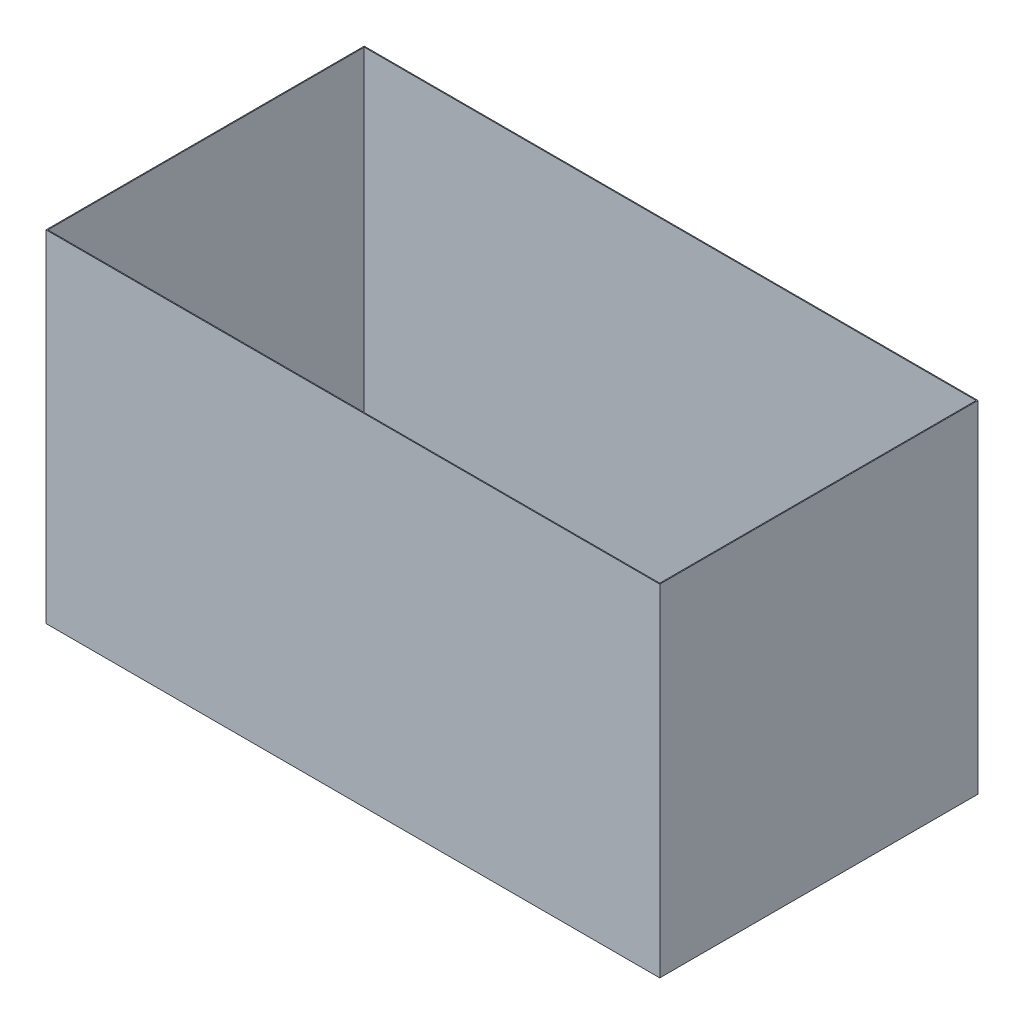
ISO-10303-21;
HEADER;
FILE_DESCRIPTION(('STEP AP214'),'2;1');
FILE_NAME('part.step','',(''),(''),'','','');
FILE_SCHEMA(('AUTOMOTIVE_DESIGN { 1 0 10303 214 1 1 1 1 }'));
ENDSEC;
DATA;
#1=APPLICATION_CONTEXT('core data for automotive mechanical design processes');
#2=APPLICATION_PROTOCOL_DEFINITION('international standard','automotive_design',2000,#1);
#3=PRODUCT_CONTEXT('',#1,'mechanical');
#4=PRODUCT('Part','Part','',(#3));
#5=PRODUCT_RELATED_PRODUCT_CATEGORY('part','',(#4));
#6=PRODUCT_DEFINITION_FORMATION('','',#4);
#7=PRODUCT_DEFINITION_CONTEXT('part definition',#1,'design');
#8=PRODUCT_DEFINITION('design','',#6,#7);
#9=PRODUCT_DEFINITION_SHAPE('','',#8);
#10=(LENGTH_UNIT() NAMED_UNIT(*) SI_UNIT(.MILLI.,.METRE.));
#11=(NAMED_UNIT(*) PLANE_ANGLE_UNIT() SI_UNIT($,.RADIAN.));
#12=(NAMED_UNIT(*) SI_UNIT($,.STERADIAN.) SOLID_ANGLE_UNIT());
#13=UNCERTAINTY_MEASURE_WITH_UNIT(LENGTH_MEASURE(1.E-05),#10,'distance_accuracy_value','');
#14=(GEOMETRIC_REPRESENTATION_CONTEXT(3) GLOBAL_UNCERTAINTY_ASSIGNED_CONTEXT((#13)) GLOBAL_UNIT_ASSIGNED_CONTEXT((#10,
#11,#12)) REPRESENTATION_CONTEXT('',''));
#15=CARTESIAN_POINT('',(0.,0.,0.));
#16=DIRECTION('',(0.,0.,1.));
#17=DIRECTION('',(1.,0.,0.));
#18=AXIS2_PLACEMENT_3D('',#15,#16,#17);
#19=CARTESIAN_POINT('',(0.,750.,0.));
#20=DIRECTION('',(0.,-1.,0.));
#21=DIRECTION('',(0.,0.,-1.));
#22=AXIS2_PLACEMENT_3D('',#19,#20,#21);
#23=PLANE('',#22);
#24=DIRECTION('',(0.,0.,1.));
#25=VECTOR('',#24,1.);
#26=CARTESIAN_POINT('',(0.,750.,0.));
#27=LINE('',#26,#25);
#28=CARTESIAN_POINT('',(0.,750.,-700.));
#29=VERTEX_POINT('',#28);
#30=CARTESIAN_POINT('',(0.,750.,0.));
#31=VERTEX_POINT('',#30);
#32=EDGE_CURVE('E151',#29,#31,#27,.T.);
#33=ORIENTED_EDGE('',*,*,#32,.T.);
#34=DIRECTION('',(1.,0.,0.));
#35=VECTOR('',#34,1.);
#36=CARTESIAN_POINT('',(0.,750.,0.));
#37=LINE('',#36,#35);
#38=CARTESIAN_POINT('',(1350.,750.,0.));
#39=VERTEX_POINT('',#38);
#40=EDGE_CURVE('E92',#31,#39,#37,.T.);
#41=ORIENTED_EDGE('',*,*,#40,.T.);
#42=DIRECTION('',(0.,0.,-1.));
#43=VECTOR('',#42,1.);
#44=CARTESIAN_POINT('',(1350.,750.,0.));
#45=LINE('',#44,#43);
#46=CARTESIAN_POINT('',(1350.,750.,-700.));
#47=VERTEX_POINT('',#46);
#48=EDGE_CURVE('E152',#39,#47,#45,.T.);
#49=ORIENTED_EDGE('',*,*,#48,.T.);
#50=DIRECTION('',(-1.,0.,0.));
#51=VECTOR('',#50,1.);
#52=CARTESIAN_POINT('',(0.,750.,-700.));
#53=LINE('',#52,#51);
#54=EDGE_CURVE('E69',#47,#29,#53,.T.);
#55=ORIENTED_EDGE('',*,*,#54,.T.);
#56=EDGE_LOOP('',(#33,#41,#49,#55));
#57=FACE_BOUND('',#56,.T.);
#58=DIRECTION('',(0.,0.,1.));
#59=VECTOR('',#58,1.);
#60=CARTESIAN_POINT('',(2.,750.,0.));
#61=LINE('',#60,#59);
#62=CARTESIAN_POINT('',(2.,750.,-698.));
#63=VERTEX_POINT('',#62);
#64=CARTESIAN_POINT('',(2.,750.,-2.));
#65=VERTEX_POINT('',#64);
#66=EDGE_CURVE('E138',#63,#65,#61,.T.);
#67=ORIENTED_EDGE('',*,*,#66,.F.);
#68=DIRECTION('',(-1.,0.,0.));
#69=VECTOR('',#68,1.);
#70=CARTESIAN_POINT('',(0.,750.,-698.));
#71=LINE('',#70,#69);
#72=CARTESIAN_POINT('',(1348.,750.,-698.));
#73=VERTEX_POINT('',#72);
#74=EDGE_CURVE('E149',#73,#63,#71,.T.);
#75=ORIENTED_EDGE('',*,*,#74,.F.);
#76=DIRECTION('',(0.,0.,-1.));
#77=VECTOR('',#76,1.);
#78=CARTESIAN_POINT('',(1348.,750.,0.));
#79=LINE('',#78,#77);
#80=CARTESIAN_POINT('',(1348.,750.,-2.));
#81=VERTEX_POINT('',#80);
#82=EDGE_CURVE('E150',#81,#73,#79,.T.);
#83=ORIENTED_EDGE('',*,*,#82,.F.);
#84=DIRECTION('',(1.,0.,0.));
#85=VECTOR('',#84,1.);
#86=CARTESIAN_POINT('',(0.,750.,-2.));
#87=LINE('',#86,#85);
#88=EDGE_CURVE('E134',#65,#81,#87,.T.);
#89=ORIENTED_EDGE('',*,*,#88,.F.);
#90=EDGE_LOOP('',(#67,#75,#83,#89));
#91=FACE_BOUND('',#90,.T.);
#92=ADVANCED_FACE('F43',(#57,#91),#23,.F.);
#93=CARTESIAN_POINT('',(0.,750.,0.));
#94=DIRECTION('',(1.,0.,0.));
#95=DIRECTION('',(0.,0.,-1.));
#96=AXIS2_PLACEMENT_3D('',#93,#94,#95);
#97=PLANE('',#96);
#98=DIRECTION('',(0.,0.,1.));
#99=VECTOR('',#98,1.);
#100=CARTESIAN_POINT('',(0.,0.,0.));
#101=LINE('',#100,#99);
#102=CARTESIAN_POINT('',(0.,0.,-700.));
#103=VERTEX_POINT('',#102);
#104=CARTESIAN_POINT('',(0.,0.,0.));
#105=VERTEX_POINT('',#104);
#106=EDGE_CURVE('E158',#103,#105,#101,.T.);
#107=ORIENTED_EDGE('',*,*,#106,.T.);
#108=DIRECTION('',(0.,-1.,0.));
#109=VECTOR('',#108,1.);
#110=CARTESIAN_POINT('',(0.,750.,0.));
#111=LINE('',#110,#109);
#112=EDGE_CURVE('E11',#31,#105,#111,.T.);
#113=ORIENTED_EDGE('',*,*,#112,.F.);
#114=ORIENTED_EDGE('',*,*,#32,.F.);
#115=DIRECTION('',(0.,-1.,0.));
#116=VECTOR('',#115,1.);
#117=CARTESIAN_POINT('',(0.,750.,-700.));
#118=LINE('',#117,#116);
#119=EDGE_CURVE('E160',#29,#103,#118,.T.);
#120=ORIENTED_EDGE('',*,*,#119,.T.);
#121=EDGE_LOOP('',(#107,#113,#114,#120));
#122=FACE_BOUND('',#121,.T.);
#123=ADVANCED_FACE('F44',(#122),#97,.F.);
#124=CARTESIAN_POINT('',(0.,750.,0.));
#125=DIRECTION('',(0.,0.,-1.));
#126=DIRECTION('',(-1.,0.,0.));
#127=AXIS2_PLACEMENT_3D('',#124,#125,#126);
#128=PLANE('',#127);
#129=DIRECTION('',(1.,0.,0.));
#130=VECTOR('',#129,1.);
#131=CARTESIAN_POINT('',(0.,0.,0.));
#132=LINE('',#131,#130);
#133=CARTESIAN_POINT('',(1350.,0.,0.));
#134=VERTEX_POINT('',#133);
#135=EDGE_CURVE('E161',#105,#134,#132,.T.);
#136=ORIENTED_EDGE('',*,*,#135,.T.);
#137=DIRECTION('',(0.,-1.,0.));
#138=VECTOR('',#137,1.);
#139=CARTESIAN_POINT('',(1350.,750.,0.));
#140=LINE('',#139,#138);
#141=EDGE_CURVE('E51',#39,#134,#140,.T.);
#142=ORIENTED_EDGE('',*,*,#141,.F.);
#143=ORIENTED_EDGE('',*,*,#40,.F.);
#144=ORIENTED_EDGE('',*,*,#112,.T.);
#145=EDGE_LOOP('',(#136,#142,#143,#144));
#146=FACE_BOUND('',#145,.T.);
#147=ADVANCED_FACE('F190',(#146),#128,.F.);
#148=CARTESIAN_POINT('',(1350.,750.,0.));
#149=DIRECTION('',(-1.,0.,0.));
#150=DIRECTION('',(0.,0.,1.));
#151=AXIS2_PLACEMENT_3D('',#148,#149,#150);
#152=PLANE('',#151);
#153=DIRECTION('',(0.,0.,-1.));
#154=VECTOR('',#153,1.);
#155=CARTESIAN_POINT('',(1350.,0.,0.));
#156=LINE('',#155,#154);
#157=CARTESIAN_POINT('',(1350.,0.,-700.));
#158=VERTEX_POINT('',#157);
#159=EDGE_CURVE('E162',#134,#158,#156,.T.);
#160=ORIENTED_EDGE('',*,*,#159,.T.);
#161=DIRECTION('',(0.,-1.,0.));
#162=VECTOR('',#161,1.);
#163=CARTESIAN_POINT('',(1350.,750.,-700.));
#164=LINE('',#163,#162);
#165=EDGE_CURVE('E170',#47,#158,#164,.T.);
#166=ORIENTED_EDGE('',*,*,#165,.F.);
#167=ORIENTED_EDGE('',*,*,#48,.F.);
#168=ORIENTED_EDGE('',*,*,#141,.T.);
#169=EDGE_LOOP('',(#160,#166,#167,#168));
#170=FACE_BOUND('',#169,.T.);
#171=ADVANCED_FACE('F174',(#170),#152,.F.);
#172=CARTESIAN_POINT('',(0.,750.,-700.));
#173=DIRECTION('',(0.,0.,1.));
#174=DIRECTION('',(1.,0.,0.));
#175=AXIS2_PLACEMENT_3D('',#172,#173,#174);
#176=PLANE('',#175);
#177=DIRECTION('',(-1.,0.,0.));
#178=VECTOR('',#177,1.);
#179=CARTESIAN_POINT('',(0.,0.,-700.));
#180=LINE('',#179,#178);
#181=EDGE_CURVE('E86',#158,#103,#180,.T.);
#182=ORIENTED_EDGE('',*,*,#181,.T.);
#183=ORIENTED_EDGE('',*,*,#119,.F.);
#184=ORIENTED_EDGE('',*,*,#54,.F.);
#185=ORIENTED_EDGE('',*,*,#165,.T.);
#186=EDGE_LOOP('',(#182,#183,#184,#185));
#187=FACE_BOUND('',#186,.T.);
#188=ADVANCED_FACE('F178',(#187),#176,.F.);
#189=CARTESIAN_POINT('',(0.,0.,0.));
#190=DIRECTION('',(0.,-1.,0.));
#191=DIRECTION('',(0.,0.,-1.));
#192=AXIS2_PLACEMENT_3D('',#189,#190,#191);
#193=PLANE('',#192);
#194=ORIENTED_EDGE('',*,*,#106,.F.);
#195=ORIENTED_EDGE('',*,*,#181,.F.);
#196=ORIENTED_EDGE('',*,*,#159,.F.);
#197=ORIENTED_EDGE('',*,*,#135,.F.);
#198=EDGE_LOOP('',(#194,#195,#196,#197));
#199=FACE_BOUND('',#198,.T.);
#200=ADVANCED_FACE('F177',(#199),#193,.T.);
#201=CARTESIAN_POINT('',(2.,750.,0.));
#202=DIRECTION('',(1.,0.,0.));
#203=DIRECTION('',(0.,0.,-1.));
#204=AXIS2_PLACEMENT_3D('',#201,#202,#203);
#205=PLANE('',#204);
#206=DIRECTION('',(0.,0.,1.));
#207=VECTOR('',#206,1.);
#208=CARTESIAN_POINT('',(2.,2.,0.));
#209=LINE('',#208,#207);
#210=CARTESIAN_POINT('',(2.,2.,-698.));
#211=VERTEX_POINT('',#210);
#212=CARTESIAN_POINT('',(2.,2.,-2.));
#213=VERTEX_POINT('',#212);
#214=EDGE_CURVE('E125',#211,#213,#209,.T.);
#215=ORIENTED_EDGE('',*,*,#214,.F.);
#216=DIRECTION('',(0.,-1.,0.));
#217=VECTOR('',#216,1.);
#218=CARTESIAN_POINT('',(2.,750.,-698.));
#219=LINE('',#218,#217);
#220=EDGE_CURVE('E141',#63,#211,#219,.T.);
#221=ORIENTED_EDGE('',*,*,#220,.F.);
#222=ORIENTED_EDGE('',*,*,#66,.T.);
#223=DIRECTION('',(0.,-1.,0.));
#224=VECTOR('',#223,1.);
#225=CARTESIAN_POINT('',(2.,750.,-2.));
#226=LINE('',#225,#224);
#227=EDGE_CURVE('E131',#65,#213,#226,.T.);
#228=ORIENTED_EDGE('',*,*,#227,.T.);
#229=EDGE_LOOP('',(#215,#221,#222,#228));
#230=FACE_BOUND('',#229,.T.);
#231=ADVANCED_FACE('F189',(#230),#205,.T.);
#232=CARTESIAN_POINT('',(0.,750.,-2.));
#233=DIRECTION('',(0.,0.,-1.));
#234=DIRECTION('',(-1.,0.,0.));
#235=AXIS2_PLACEMENT_3D('',#232,#233,#234);
#236=PLANE('',#235);
#237=DIRECTION('',(1.,0.,0.));
#238=VECTOR('',#237,1.);
#239=CARTESIAN_POINT('',(0.,2.,-2.));
#240=LINE('',#239,#238);
#241=CARTESIAN_POINT('',(1348.,2.,-2.));
#242=VERTEX_POINT('',#241);
#243=EDGE_CURVE('E119',#213,#242,#240,.T.);
#244=ORIENTED_EDGE('',*,*,#243,.F.);
#245=ORIENTED_EDGE('',*,*,#227,.F.);
#246=ORIENTED_EDGE('',*,*,#88,.T.);
#247=DIRECTION('',(0.,-1.,0.));
#248=VECTOR('',#247,1.);
#249=CARTESIAN_POINT('',(1348.,750.,-2.));
#250=LINE('',#249,#248);
#251=EDGE_CURVE('E129',#81,#242,#250,.T.);
#252=ORIENTED_EDGE('',*,*,#251,.T.);
#253=EDGE_LOOP('',(#244,#245,#246,#252));
#254=FACE_BOUND('',#253,.T.);
#255=ADVANCED_FACE('F128',(#254),#236,.T.);
#256=CARTESIAN_POINT('',(1348.,750.,0.));
#257=DIRECTION('',(-1.,0.,0.));
#258=DIRECTION('',(0.,0.,1.));
#259=AXIS2_PLACEMENT_3D('',#256,#257,#258);
#260=PLANE('',#259);
#261=DIRECTION('',(0.,0.,-1.));
#262=VECTOR('',#261,1.);
#263=CARTESIAN_POINT('',(1348.,2.,0.));
#264=LINE('',#263,#262);
#265=CARTESIAN_POINT('',(1348.,2.,-698.));
#266=VERTEX_POINT('',#265);
#267=EDGE_CURVE('E122',#242,#266,#264,.T.);
#268=ORIENTED_EDGE('',*,*,#267,.F.);
#269=ORIENTED_EDGE('',*,*,#251,.F.);
#270=ORIENTED_EDGE('',*,*,#82,.T.);
#271=DIRECTION('',(0.,-1.,0.));
#272=VECTOR('',#271,1.);
#273=CARTESIAN_POINT('',(1348.,750.,-698.));
#274=LINE('',#273,#272);
#275=EDGE_CURVE('E59',#73,#266,#274,.T.);
#276=ORIENTED_EDGE('',*,*,#275,.T.);
#277=EDGE_LOOP('',(#268,#269,#270,#276));
#278=FACE_BOUND('',#277,.T.);
#279=ADVANCED_FACE('F139',(#278),#260,.T.);
#280=CARTESIAN_POINT('',(0.,750.,-698.));
#281=DIRECTION('',(0.,0.,1.));
#282=DIRECTION('',(1.,0.,0.));
#283=AXIS2_PLACEMENT_3D('',#280,#281,#282);
#284=PLANE('',#283);
#285=DIRECTION('',(-1.,0.,0.));
#286=VECTOR('',#285,1.);
#287=CARTESIAN_POINT('',(0.,2.,-698.));
#288=LINE('',#287,#286);
#289=EDGE_CURVE('E140',#266,#211,#288,.T.);
#290=ORIENTED_EDGE('',*,*,#289,.F.);
#291=ORIENTED_EDGE('',*,*,#275,.F.);
#292=ORIENTED_EDGE('',*,*,#74,.T.);
#293=ORIENTED_EDGE('',*,*,#220,.T.);
#294=EDGE_LOOP('',(#290,#291,#292,#293));
#295=FACE_BOUND('',#294,.T.);
#296=ADVANCED_FACE('F203',(#295),#284,.T.);
#297=CARTESIAN_POINT('',(0.,2.,0.));
#298=DIRECTION('',(0.,-1.,0.));
#299=DIRECTION('',(0.,0.,-1.));
#300=AXIS2_PLACEMENT_3D('',#297,#298,#299);
#301=PLANE('',#300);
#302=ORIENTED_EDGE('',*,*,#214,.T.);
#303=ORIENTED_EDGE('',*,*,#243,.T.);
#304=ORIENTED_EDGE('',*,*,#267,.T.);
#305=ORIENTED_EDGE('',*,*,#289,.T.);
#306=EDGE_LOOP('',(#302,#303,#304,#305));
#307=FACE_BOUND('',#306,.T.);
#308=ADVANCED_FACE('F120',(#307),#301,.F.);
#309=CLOSED_SHELL('',(#92,#123,#147,#171,#188,#200,#231,#255,#279,#296,#308));
#310=MANIFOLD_SOLID_BREP('B2',#309);
#311=ADVANCED_BREP_SHAPE_REPRESENTATION('',(#18,#310),#14);
#312=SHAPE_DEFINITION_REPRESENTATION(#9,#311);
ENDSEC;
END-ISO-10303-21;
